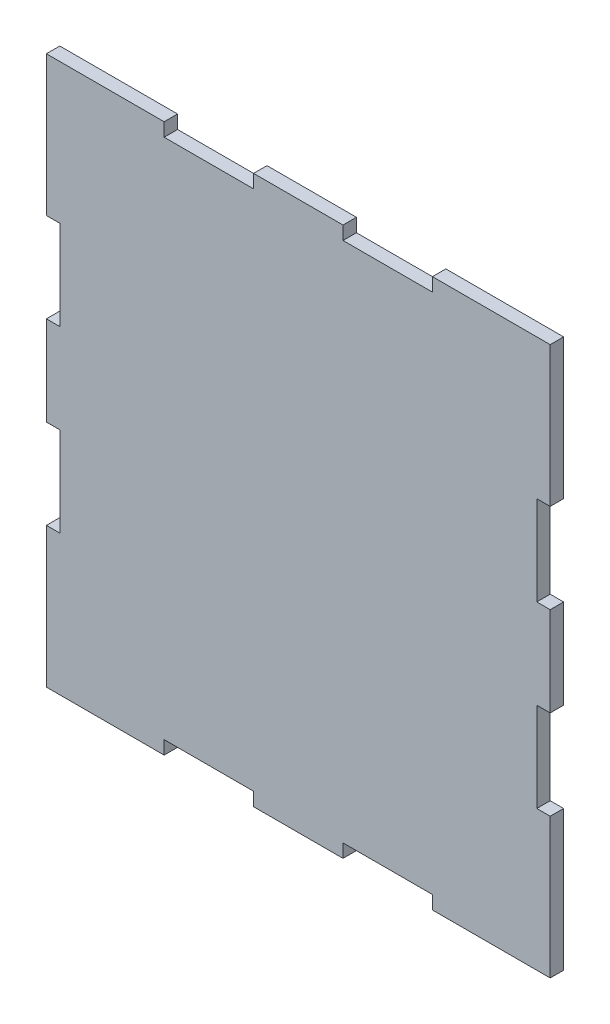
ISO-10303-21;
HEADER;
FILE_DESCRIPTION(('STEP AP214'),'2;1');
FILE_NAME('part.step','',(''),(''),'','','');
FILE_SCHEMA(('AUTOMOTIVE_DESIGN { 1 0 10303 214 1 1 1 1 }'));
ENDSEC;
DATA;
#1=APPLICATION_CONTEXT('core data for automotive mechanical design processes');
#2=APPLICATION_PROTOCOL_DEFINITION('international standard','automotive_design',2000,#1);
#3=PRODUCT_CONTEXT('',#1,'mechanical');
#4=PRODUCT('Part','Part','',(#3));
#5=PRODUCT_RELATED_PRODUCT_CATEGORY('part','',(#4));
#6=PRODUCT_DEFINITION_FORMATION('','',#4);
#7=PRODUCT_DEFINITION_CONTEXT('part definition',#1,'design');
#8=PRODUCT_DEFINITION('design','',#6,#7);
#9=PRODUCT_DEFINITION_SHAPE('','',#8);
#10=(LENGTH_UNIT() NAMED_UNIT(*) SI_UNIT(.MILLI.,.METRE.));
#11=(NAMED_UNIT(*) PLANE_ANGLE_UNIT() SI_UNIT($,.RADIAN.));
#12=(NAMED_UNIT(*) SI_UNIT($,.STERADIAN.) SOLID_ANGLE_UNIT());
#13=UNCERTAINTY_MEASURE_WITH_UNIT(LENGTH_MEASURE(1.E-05),#10,'distance_accuracy_value','');
#14=(GEOMETRIC_REPRESENTATION_CONTEXT(3) GLOBAL_UNCERTAINTY_ASSIGNED_CONTEXT((#13)) GLOBAL_UNIT_ASSIGNED_CONTEXT((#10,
#11,#12)) REPRESENTATION_CONTEXT('',''));
#15=CARTESIAN_POINT('',(0.,0.,0.));
#16=DIRECTION('',(0.,0.,1.));
#17=DIRECTION('',(1.,0.,0.));
#18=AXIS2_PLACEMENT_3D('',#15,#16,#17);
#19=CARTESIAN_POINT('',(0.,269.84,9.));
#20=DIRECTION('',(0.,-1.,0.));
#21=DIRECTION('',(0.,0.,-1.));
#22=AXIS2_PLACEMENT_3D('',#19,#20,#21);
#23=PLANE('',#22);
#24=DIRECTION('',(-1.,0.,0.));
#25=VECTOR('',#24,1.);
#26=CARTESIAN_POINT('',(0.,269.84,0.));
#27=LINE('',#26,#25);
#28=CARTESIAN_POINT('',(320.,269.84,0.));
#29=VERTEX_POINT('',#28);
#30=CARTESIAN_POINT('',(311.,269.84,0.));
#31=VERTEX_POINT('',#30);
#32=EDGE_CURVE('E309',#29,#31,#27,.T.);
#33=ORIENTED_EDGE('',*,*,#32,.F.);
#34=DIRECTION('',(0.,0.,-1.));
#35=VECTOR('',#34,1.);
#36=CARTESIAN_POINT('',(320.,269.84,9.));
#37=LINE('',#36,#35);
#38=CARTESIAN_POINT('',(320.,269.84,9.));
#39=VERTEX_POINT('',#38);
#40=EDGE_CURVE('E11',#39,#29,#37,.T.);
#41=ORIENTED_EDGE('',*,*,#40,.F.);
#42=DIRECTION('',(-1.,0.,0.));
#43=VECTOR('',#42,1.);
#44=CARTESIAN_POINT('',(0.,269.84,9.));
#45=LINE('',#44,#43);
#46=CARTESIAN_POINT('',(311.,269.84,9.));
#47=VERTEX_POINT('',#46);
#48=EDGE_CURVE('E402',#39,#47,#45,.T.);
#49=ORIENTED_EDGE('',*,*,#48,.T.);
#50=DIRECTION('',(0.,0.,-1.));
#51=VECTOR('',#50,1.);
#52=CARTESIAN_POINT('',(311.,269.84,9.));
#53=LINE('',#52,#51);
#54=EDGE_CURVE('E63',#47,#31,#53,.T.);
#55=ORIENTED_EDGE('',*,*,#54,.T.);
#56=EDGE_LOOP('',(#33,#41,#49,#55));
#57=FACE_BOUND('',#56,.T.);
#58=ADVANCED_FACE('F47',(#57),#23,.T.);
#59=CARTESIAN_POINT('',(320.,0.,9.));
#60=DIRECTION('',(-1.,0.,0.));
#61=DIRECTION('',(0.,0.,1.));
#62=AXIS2_PLACEMENT_3D('',#59,#60,#61);
#63=PLANE('',#62);
#64=DIRECTION('',(0.,1.,0.));
#65=VECTOR('',#64,1.);
#66=CARTESIAN_POINT('',(320.,0.,0.));
#67=LINE('',#66,#65);
#68=CARTESIAN_POINT('',(320.,363.84,0.));
#69=VERTEX_POINT('',#68);
#70=EDGE_CURVE('E311',#29,#69,#67,.T.);
#71=ORIENTED_EDGE('',*,*,#70,.T.);
#72=DIRECTION('',(0.,0.,-1.));
#73=VECTOR('',#72,1.);
#74=CARTESIAN_POINT('',(320.,363.84,9.));
#75=LINE('',#74,#73);
#76=CARTESIAN_POINT('',(320.,363.84,9.));
#77=VERTEX_POINT('',#76);
#78=EDGE_CURVE('E55',#77,#69,#75,.T.);
#79=ORIENTED_EDGE('',*,*,#78,.F.);
#80=DIRECTION('',(0.,1.,0.));
#81=VECTOR('',#80,1.);
#82=CARTESIAN_POINT('',(320.,0.,9.));
#83=LINE('',#82,#81);
#84=EDGE_CURVE('E498',#39,#77,#83,.T.);
#85=ORIENTED_EDGE('',*,*,#84,.F.);
#86=ORIENTED_EDGE('',*,*,#40,.T.);
#87=EDGE_LOOP('',(#71,#79,#85,#86));
#88=FACE_BOUND('',#87,.T.);
#89=ADVANCED_FACE('F484',(#88),#63,.F.);
#90=CARTESIAN_POINT('',(6.73239242132706E-12,363.840000000006,9.));
#91=DIRECTION('',(0.,1.,0.));
#92=DIRECTION('',(-1.,0.,0.));
#93=AXIS2_PLACEMENT_3D('',#90,#91,#92);
#94=PLANE('',#93);
#95=DIRECTION('',(1.,0.,0.));
#96=VECTOR('',#95,1.);
#97=CARTESIAN_POINT('',(6.73239242132706E-12,363.840000000006,0.));
#98=LINE('',#97,#96);
#99=CARTESIAN_POINT('',(241.,363.84,0.));
#100=VERTEX_POINT('',#99);
#101=EDGE_CURVE('E314',#100,#69,#98,.T.);
#102=ORIENTED_EDGE('',*,*,#101,.F.);
#103=DIRECTION('',(0.,0.,-1.));
#104=VECTOR('',#103,1.);
#105=CARTESIAN_POINT('',(241.,363.84,9.));
#106=LINE('',#105,#104);
#107=CARTESIAN_POINT('',(241.,363.84,9.));
#108=VERTEX_POINT('',#107);
#109=EDGE_CURVE('E474',#108,#100,#106,.T.);
#110=ORIENTED_EDGE('',*,*,#109,.F.);
#111=DIRECTION('',(1.,0.,0.));
#112=VECTOR('',#111,1.);
#113=CARTESIAN_POINT('',(6.73239242132706E-12,363.840000000006,9.));
#114=LINE('',#113,#112);
#115=EDGE_CURVE('E481',#108,#77,#114,.T.);
#116=ORIENTED_EDGE('',*,*,#115,.T.);
#117=ORIENTED_EDGE('',*,*,#78,.T.);
#118=EDGE_LOOP('',(#102,#110,#116,#117));
#119=FACE_BOUND('',#118,.T.);
#120=ADVANCED_FACE('F479',(#119),#94,.T.);
#121=CARTESIAN_POINT('',(241.,0.,9.));
#122=DIRECTION('',(1.,0.,0.));
#123=DIRECTION('',(0.,0.,-1.));
#124=AXIS2_PLACEMENT_3D('',#121,#122,#123);
#125=PLANE('',#124);
#126=DIRECTION('',(0.,-1.,0.));
#127=VECTOR('',#126,1.);
#128=CARTESIAN_POINT('',(241.,0.,0.));
#129=LINE('',#128,#127);
#130=CARTESIAN_POINT('',(241.,354.84,0.));
#131=VERTEX_POINT('',#130);
#132=EDGE_CURVE('E317',#100,#131,#129,.T.);
#133=ORIENTED_EDGE('',*,*,#132,.T.);
#134=DIRECTION('',(0.,0.,-1.));
#135=VECTOR('',#134,1.);
#136=CARTESIAN_POINT('',(241.,354.84,9.));
#137=LINE('',#136,#135);
#138=CARTESIAN_POINT('',(241.,354.84,9.));
#139=VERTEX_POINT('',#138);
#140=EDGE_CURVE('E472',#139,#131,#137,.T.);
#141=ORIENTED_EDGE('',*,*,#140,.F.);
#142=DIRECTION('',(0.,-1.,0.));
#143=VECTOR('',#142,1.);
#144=CARTESIAN_POINT('',(241.,0.,9.));
#145=LINE('',#144,#143);
#146=EDGE_CURVE('E494',#108,#139,#145,.T.);
#147=ORIENTED_EDGE('',*,*,#146,.F.);
#148=ORIENTED_EDGE('',*,*,#109,.T.);
#149=EDGE_LOOP('',(#133,#141,#147,#148));
#150=FACE_BOUND('',#149,.T.);
#151=ADVANCED_FACE('F491',(#150),#125,.F.);
#152=CARTESIAN_POINT('',(3.28292948381659E-13,354.84,9.));
#153=DIRECTION('',(0.,1.,0.));
#154=DIRECTION('',(-1.,0.,0.));
#155=AXIS2_PLACEMENT_3D('',#152,#153,#154);
#156=PLANE('',#155);
#157=DIRECTION('',(1.,0.,0.));
#158=VECTOR('',#157,1.);
#159=CARTESIAN_POINT('',(3.28292948381659E-13,354.84,0.));
#160=LINE('',#159,#158);
#161=CARTESIAN_POINT('',(181.,354.84,0.));
#162=VERTEX_POINT('',#161);
#163=EDGE_CURVE('E320',#162,#131,#160,.T.);
#164=ORIENTED_EDGE('',*,*,#163,.F.);
#165=DIRECTION('',(0.,0.,-1.));
#166=VECTOR('',#165,1.);
#167=CARTESIAN_POINT('',(181.,354.84,9.));
#168=LINE('',#167,#166);
#169=CARTESIAN_POINT('',(181.,354.84,9.));
#170=VERTEX_POINT('',#169);
#171=EDGE_CURVE('E470',#170,#162,#168,.T.);
#172=ORIENTED_EDGE('',*,*,#171,.F.);
#173=DIRECTION('',(1.,0.,0.));
#174=VECTOR('',#173,1.);
#175=CARTESIAN_POINT('',(3.28292948381659E-13,354.84,9.));
#176=LINE('',#175,#174);
#177=EDGE_CURVE('E496',#170,#139,#176,.T.);
#178=ORIENTED_EDGE('',*,*,#177,.T.);
#179=ORIENTED_EDGE('',*,*,#140,.T.);
#180=EDGE_LOOP('',(#164,#172,#178,#179));
#181=FACE_BOUND('',#180,.T.);
#182=ADVANCED_FACE('F602',(#181),#156,.T.);
#183=CARTESIAN_POINT('',(181.,0.,9.));
#184=DIRECTION('',(1.,0.,0.));
#185=DIRECTION('',(0.,0.,-1.));
#186=AXIS2_PLACEMENT_3D('',#183,#184,#185);
#187=PLANE('',#186);
#188=DIRECTION('',(0.,-1.,0.));
#189=VECTOR('',#188,1.);
#190=CARTESIAN_POINT('',(181.,0.,0.));
#191=LINE('',#190,#189);
#192=CARTESIAN_POINT('',(181.,363.84,0.));
#193=VERTEX_POINT('',#192);
#194=EDGE_CURVE('E323',#193,#162,#191,.T.);
#195=ORIENTED_EDGE('',*,*,#194,.F.);
#196=DIRECTION('',(0.,0.,-1.));
#197=VECTOR('',#196,1.);
#198=CARTESIAN_POINT('',(181.,363.84,9.));
#199=LINE('',#198,#197);
#200=CARTESIAN_POINT('',(181.,363.84,9.));
#201=VERTEX_POINT('',#200);
#202=EDGE_CURVE('E468',#201,#193,#199,.T.);
#203=ORIENTED_EDGE('',*,*,#202,.F.);
#204=DIRECTION('',(0.,-1.,0.));
#205=VECTOR('',#204,1.);
#206=CARTESIAN_POINT('',(181.,0.,9.));
#207=LINE('',#206,#205);
#208=EDGE_CURVE('E504',#201,#170,#207,.T.);
#209=ORIENTED_EDGE('',*,*,#208,.T.);
#210=ORIENTED_EDGE('',*,*,#171,.T.);
#211=EDGE_LOOP('',(#195,#203,#209,#210));
#212=FACE_BOUND('',#211,.T.);
#213=ADVANCED_FACE('F605',(#212),#187,.T.);
#214=CARTESIAN_POINT('',(0.,363.84,9.));
#215=DIRECTION('',(0.,1.,0.));
#216=DIRECTION('',(0.,0.,1.));
#217=AXIS2_PLACEMENT_3D('',#214,#215,#216);
#218=PLANE('',#217);
#219=DIRECTION('',(1.,0.,0.));
#220=VECTOR('',#219,1.);
#221=CARTESIAN_POINT('',(0.,363.84,0.));
#222=LINE('',#221,#220);
#223=CARTESIAN_POINT('',(121.,363.84,0.));
#224=VERTEX_POINT('',#223);
#225=EDGE_CURVE('E326',#224,#193,#222,.T.);
#226=ORIENTED_EDGE('',*,*,#225,.F.);
#227=DIRECTION('',(0.,0.,-1.));
#228=VECTOR('',#227,1.);
#229=CARTESIAN_POINT('',(121.,363.84,9.));
#230=LINE('',#229,#228);
#231=CARTESIAN_POINT('',(121.,363.84,9.));
#232=VERTEX_POINT('',#231);
#233=EDGE_CURVE('E466',#232,#224,#230,.T.);
#234=ORIENTED_EDGE('',*,*,#233,.F.);
#235=DIRECTION('',(1.,0.,0.));
#236=VECTOR('',#235,1.);
#237=CARTESIAN_POINT('',(0.,363.84,9.));
#238=LINE('',#237,#236);
#239=EDGE_CURVE('E507',#232,#201,#238,.T.);
#240=ORIENTED_EDGE('',*,*,#239,.T.);
#241=ORIENTED_EDGE('',*,*,#202,.T.);
#242=EDGE_LOOP('',(#226,#234,#240,#241));
#243=FACE_BOUND('',#242,.T.);
#244=ADVANCED_FACE('F609',(#243),#218,.T.);
#245=CARTESIAN_POINT('',(121.,0.,9.));
#246=DIRECTION('',(1.,0.,0.));
#247=DIRECTION('',(0.,0.,-1.));
#248=AXIS2_PLACEMENT_3D('',#245,#246,#247);
#249=PLANE('',#248);
#250=DIRECTION('',(0.,-1.,0.));
#251=VECTOR('',#250,1.);
#252=CARTESIAN_POINT('',(121.,0.,0.));
#253=LINE('',#252,#251);
#254=CARTESIAN_POINT('',(121.,354.84,0.));
#255=VERTEX_POINT('',#254);
#256=EDGE_CURVE('E329',#224,#255,#253,.T.);
#257=ORIENTED_EDGE('',*,*,#256,.T.);
#258=DIRECTION('',(0.,0.,-1.));
#259=VECTOR('',#258,1.);
#260=CARTESIAN_POINT('',(121.,354.84,9.));
#261=LINE('',#260,#259);
#262=CARTESIAN_POINT('',(121.,354.84,9.));
#263=VERTEX_POINT('',#262);
#264=EDGE_CURVE('E464',#263,#255,#261,.T.);
#265=ORIENTED_EDGE('',*,*,#264,.F.);
#266=DIRECTION('',(0.,-1.,0.));
#267=VECTOR('',#266,1.);
#268=CARTESIAN_POINT('',(121.,0.,9.));
#269=LINE('',#268,#267);
#270=EDGE_CURVE('E510',#232,#263,#269,.T.);
#271=ORIENTED_EDGE('',*,*,#270,.F.);
#272=ORIENTED_EDGE('',*,*,#233,.T.);
#273=EDGE_LOOP('',(#257,#265,#271,#272));
#274=FACE_BOUND('',#273,.T.);
#275=ADVANCED_FACE('F613',(#274),#249,.F.);
#276=CARTESIAN_POINT('',(-3.28292948381659E-13,354.84,9.));
#277=DIRECTION('',(0.,1.,0.));
#278=DIRECTION('',(-1.,0.,0.));
#279=AXIS2_PLACEMENT_3D('',#276,#277,#278);
#280=PLANE('',#279);
#281=DIRECTION('',(1.,0.,0.));
#282=VECTOR('',#281,1.);
#283=CARTESIAN_POINT('',(-3.28292948381659E-13,354.84,0.));
#284=LINE('',#283,#282);
#285=CARTESIAN_POINT('',(60.9999999999999,354.84,0.));
#286=VERTEX_POINT('',#285);
#287=EDGE_CURVE('E332',#286,#255,#284,.T.);
#288=ORIENTED_EDGE('',*,*,#287,.F.);
#289=DIRECTION('',(0.,0.,-1.));
#290=VECTOR('',#289,1.);
#291=CARTESIAN_POINT('',(60.9999999999999,354.84,9.));
#292=LINE('',#291,#290);
#293=CARTESIAN_POINT('',(60.9999999999999,354.84,9.));
#294=VERTEX_POINT('',#293);
#295=EDGE_CURVE('E462',#294,#286,#292,.T.);
#296=ORIENTED_EDGE('',*,*,#295,.F.);
#297=DIRECTION('',(1.,0.,0.));
#298=VECTOR('',#297,1.);
#299=CARTESIAN_POINT('',(-3.28292948381659E-13,354.84,9.));
#300=LINE('',#299,#298);
#301=EDGE_CURVE('E512',#294,#263,#300,.T.);
#302=ORIENTED_EDGE('',*,*,#301,.T.);
#303=ORIENTED_EDGE('',*,*,#264,.T.);
#304=EDGE_LOOP('',(#288,#296,#302,#303));
#305=FACE_BOUND('',#304,.T.);
#306=ADVANCED_FACE('F617',(#305),#280,.T.);
#307=CARTESIAN_POINT('',(60.9999999999999,0.,9.));
#308=DIRECTION('',(1.,0.,0.));
#309=DIRECTION('',(0.,0.,-1.));
#310=AXIS2_PLACEMENT_3D('',#307,#308,#309);
#311=PLANE('',#310);
#312=DIRECTION('',(0.,-1.,0.));
#313=VECTOR('',#312,1.);
#314=CARTESIAN_POINT('',(60.9999999999999,0.,0.));
#315=LINE('',#314,#313);
#316=CARTESIAN_POINT('',(60.9999999999999,363.84,0.));
#317=VERTEX_POINT('',#316);
#318=EDGE_CURVE('E335',#317,#286,#315,.T.);
#319=ORIENTED_EDGE('',*,*,#318,.F.);
#320=DIRECTION('',(0.,0.,-1.));
#321=VECTOR('',#320,1.);
#322=CARTESIAN_POINT('',(60.9999999999999,363.84,9.));
#323=LINE('',#322,#321);
#324=CARTESIAN_POINT('',(60.9999999999999,363.84,9.));
#325=VERTEX_POINT('',#324);
#326=EDGE_CURVE('E460',#325,#317,#323,.T.);
#327=ORIENTED_EDGE('',*,*,#326,.F.);
#328=DIRECTION('',(0.,-1.,0.));
#329=VECTOR('',#328,1.);
#330=CARTESIAN_POINT('',(60.9999999999999,0.,9.));
#331=LINE('',#330,#329);
#332=EDGE_CURVE('E515',#325,#294,#331,.T.);
#333=ORIENTED_EDGE('',*,*,#332,.T.);
#334=ORIENTED_EDGE('',*,*,#295,.T.);
#335=EDGE_LOOP('',(#319,#327,#333,#334));
#336=FACE_BOUND('',#335,.T.);
#337=ADVANCED_FACE('F621',(#336),#311,.T.);
#338=CARTESIAN_POINT('',(-5.7706220754231E-13,363.84,9.));
#339=DIRECTION('',(0.,1.,0.));
#340=DIRECTION('',(-1.,0.,0.));
#341=AXIS2_PLACEMENT_3D('',#338,#339,#340);
#342=PLANE('',#341);
#343=DIRECTION('',(1.,0.,0.));
#344=VECTOR('',#343,1.);
#345=CARTESIAN_POINT('',(-5.7706220754231E-13,363.84,0.));
#346=LINE('',#345,#344);
#347=CARTESIAN_POINT('',(-18.0000000000001,363.84,0.));
#348=VERTEX_POINT('',#347);
#349=EDGE_CURVE('E338',#348,#317,#346,.T.);
#350=ORIENTED_EDGE('',*,*,#349,.F.);
#351=DIRECTION('',(0.,0.,-1.));
#352=VECTOR('',#351,1.);
#353=CARTESIAN_POINT('',(-18.0000000000001,363.84,9.));
#354=LINE('',#353,#352);
#355=CARTESIAN_POINT('',(-18.0000000000001,363.84,9.));
#356=VERTEX_POINT('',#355);
#357=EDGE_CURVE('E458',#356,#348,#354,.T.);
#358=ORIENTED_EDGE('',*,*,#357,.F.);
#359=DIRECTION('',(1.,0.,0.));
#360=VECTOR('',#359,1.);
#361=CARTESIAN_POINT('',(-5.7706220754231E-13,363.84,9.));
#362=LINE('',#361,#360);
#363=EDGE_CURVE('E518',#356,#325,#362,.T.);
#364=ORIENTED_EDGE('',*,*,#363,.T.);
#365=ORIENTED_EDGE('',*,*,#326,.T.);
#366=EDGE_LOOP('',(#350,#358,#364,#365));
#367=FACE_BOUND('',#366,.T.);
#368=ADVANCED_FACE('F625',(#367),#342,.T.);
#369=CARTESIAN_POINT('',(-17.9999999999999,0.,9.));
#370=DIRECTION('',(-1.,0.,0.));
#371=DIRECTION('',(0.,-1.,0.));
#372=AXIS2_PLACEMENT_3D('',#369,#370,#371);
#373=PLANE('',#372);
#374=DIRECTION('',(0.,1.,0.));
#375=VECTOR('',#374,1.);
#376=CARTESIAN_POINT('',(-17.9999999999999,0.,0.));
#377=LINE('',#376,#375);
#378=CARTESIAN_POINT('',(-18.,269.84,0.));
#379=VERTEX_POINT('',#378);
#380=EDGE_CURVE('E341',#379,#348,#377,.T.);
#381=ORIENTED_EDGE('',*,*,#380,.F.);
#382=DIRECTION('',(0.,0.,-1.));
#383=VECTOR('',#382,1.);
#384=CARTESIAN_POINT('',(-18.,269.84,9.));
#385=LINE('',#384,#383);
#386=CARTESIAN_POINT('',(-18.,269.84,9.));
#387=VERTEX_POINT('',#386);
#388=EDGE_CURVE('E456',#387,#379,#385,.T.);
#389=ORIENTED_EDGE('',*,*,#388,.F.);
#390=DIRECTION('',(0.,1.,0.));
#391=VECTOR('',#390,1.);
#392=CARTESIAN_POINT('',(-17.9999999999999,0.,9.));
#393=LINE('',#392,#391);
#394=EDGE_CURVE('E521',#387,#356,#393,.T.);
#395=ORIENTED_EDGE('',*,*,#394,.T.);
#396=ORIENTED_EDGE('',*,*,#357,.T.);
#397=EDGE_LOOP('',(#381,#389,#395,#396));
#398=FACE_BOUND('',#397,.T.);
#399=ADVANCED_FACE('F629',(#398),#373,.T.);
#400=CARTESIAN_POINT('',(0.,269.84,9.));
#401=DIRECTION('',(0.,1.,0.));
#402=DIRECTION('',(0.,0.,1.));
#403=AXIS2_PLACEMENT_3D('',#400,#401,#402);
#404=PLANE('',#403);
#405=DIRECTION('',(1.,0.,0.));
#406=VECTOR('',#405,1.);
#407=CARTESIAN_POINT('',(0.,269.84,0.));
#408=LINE('',#407,#406);
#409=CARTESIAN_POINT('',(-8.99999999999998,269.84,0.));
#410=VERTEX_POINT('',#409);
#411=EDGE_CURVE('E344',#379,#410,#408,.T.);
#412=ORIENTED_EDGE('',*,*,#411,.T.);
#413=DIRECTION('',(0.,0.,-1.));
#414=VECTOR('',#413,1.);
#415=CARTESIAN_POINT('',(-8.99999999999998,269.84,9.));
#416=LINE('',#415,#414);
#417=CARTESIAN_POINT('',(-8.99999999999998,269.84,9.));
#418=VERTEX_POINT('',#417);
#419=EDGE_CURVE('E453',#418,#410,#416,.T.);
#420=ORIENTED_EDGE('',*,*,#419,.F.);
#421=DIRECTION('',(1.,0.,0.));
#422=VECTOR('',#421,1.);
#423=CARTESIAN_POINT('',(0.,269.84,9.));
#424=LINE('',#423,#422);
#425=EDGE_CURVE('E524',#387,#418,#424,.T.);
#426=ORIENTED_EDGE('',*,*,#425,.F.);
#427=ORIENTED_EDGE('',*,*,#388,.T.);
#428=EDGE_LOOP('',(#412,#420,#426,#427));
#429=FACE_BOUND('',#428,.T.);
#430=ADVANCED_FACE('F633',(#429),#404,.F.);
#431=CARTESIAN_POINT('',(-9.00000000000005,0.,9.));
#432=DIRECTION('',(1.,0.,0.));
#433=DIRECTION('',(0.,1.,0.));
#434=AXIS2_PLACEMENT_3D('',#431,#432,#433);
#435=PLANE('',#434);
#436=DIRECTION('',(0.,-1.,0.));
#437=VECTOR('',#436,1.);
#438=CARTESIAN_POINT('',(-9.00000000000005,0.,0.));
#439=LINE('',#438,#437);
#440=CARTESIAN_POINT('',(-9.,209.84,0.));
#441=VERTEX_POINT('',#440);
#442=EDGE_CURVE('E346',#410,#441,#439,.T.);
#443=ORIENTED_EDGE('',*,*,#442,.T.);
#444=DIRECTION('',(0.,0.,-1.));
#445=VECTOR('',#444,1.);
#446=CARTESIAN_POINT('',(-9.,209.84,9.));
#447=LINE('',#446,#445);
#448=CARTESIAN_POINT('',(-9.,209.84,9.));
#449=VERTEX_POINT('',#448);
#450=EDGE_CURVE('E450',#449,#441,#447,.T.);
#451=ORIENTED_EDGE('',*,*,#450,.F.);
#452=DIRECTION('',(0.,-1.,0.));
#453=VECTOR('',#452,1.);
#454=CARTESIAN_POINT('',(-9.00000000000005,0.,9.));
#455=LINE('',#454,#453);
#456=EDGE_CURVE('E526',#418,#449,#455,.T.);
#457=ORIENTED_EDGE('',*,*,#456,.F.);
#458=ORIENTED_EDGE('',*,*,#419,.T.);
#459=EDGE_LOOP('',(#443,#451,#457,#458));
#460=FACE_BOUND('',#459,.T.);
#461=ADVANCED_FACE('F637',(#460),#435,.F.);
#462=CARTESIAN_POINT('',(-1.29427333048524E-12,209.84,9.));
#463=DIRECTION('',(0.,-1.,0.));
#464=DIRECTION('',(1.,0.,0.));
#465=AXIS2_PLACEMENT_3D('',#462,#463,#464);
#466=PLANE('',#465);
#467=DIRECTION('',(-1.,0.,0.));
#468=VECTOR('',#467,1.);
#469=CARTESIAN_POINT('',(-1.29427333048524E-12,209.84,0.));
#470=LINE('',#469,#468);
#471=CARTESIAN_POINT('',(-18.,209.84,0.));
#472=VERTEX_POINT('',#471);
#473=EDGE_CURVE('E348',#441,#472,#470,.T.);
#474=ORIENTED_EDGE('',*,*,#473,.T.);
#475=DIRECTION('',(0.,0.,-1.));
#476=VECTOR('',#475,1.);
#477=CARTESIAN_POINT('',(-18.,209.84,9.));
#478=LINE('',#477,#476);
#479=CARTESIAN_POINT('',(-18.,209.84,9.));
#480=VERTEX_POINT('',#479);
#481=EDGE_CURVE('E448',#480,#472,#478,.T.);
#482=ORIENTED_EDGE('',*,*,#481,.F.);
#483=DIRECTION('',(-1.,0.,0.));
#484=VECTOR('',#483,1.);
#485=CARTESIAN_POINT('',(-1.29427333048524E-12,209.84,9.));
#486=LINE('',#485,#484);
#487=EDGE_CURVE('E528',#449,#480,#486,.T.);
#488=ORIENTED_EDGE('',*,*,#487,.F.);
#489=ORIENTED_EDGE('',*,*,#450,.T.);
#490=EDGE_LOOP('',(#474,#482,#488,#489));
#491=FACE_BOUND('',#490,.T.);
#492=ADVANCED_FACE('F641',(#491),#466,.F.);
#493=CARTESIAN_POINT('',(-18.,0.,9.));
#494=DIRECTION('',(-1.,0.,0.));
#495=DIRECTION('',(0.,0.,1.));
#496=AXIS2_PLACEMENT_3D('',#493,#494,#495);
#497=PLANE('',#496);
#498=DIRECTION('',(0.,1.,0.));
#499=VECTOR('',#498,1.);
#500=CARTESIAN_POINT('',(-18.,0.,0.));
#501=LINE('',#500,#499);
#502=CARTESIAN_POINT('',(-18.,149.84,0.));
#503=VERTEX_POINT('',#502);
#504=EDGE_CURVE('E351',#503,#472,#501,.T.);
#505=ORIENTED_EDGE('',*,*,#504,.F.);
#506=DIRECTION('',(0.,0.,-1.));
#507=VECTOR('',#506,1.);
#508=CARTESIAN_POINT('',(-18.,149.84,9.));
#509=LINE('',#508,#507);
#510=CARTESIAN_POINT('',(-18.,149.84,9.));
#511=VERTEX_POINT('',#510);
#512=EDGE_CURVE('E446',#511,#503,#509,.T.);
#513=ORIENTED_EDGE('',*,*,#512,.F.);
#514=DIRECTION('',(0.,1.,0.));
#515=VECTOR('',#514,1.);
#516=CARTESIAN_POINT('',(-18.,0.,9.));
#517=LINE('',#516,#515);
#518=EDGE_CURVE('E530',#511,#480,#517,.T.);
#519=ORIENTED_EDGE('',*,*,#518,.T.);
#520=ORIENTED_EDGE('',*,*,#481,.T.);
#521=EDGE_LOOP('',(#505,#513,#519,#520));
#522=FACE_BOUND('',#521,.T.);
#523=ADVANCED_FACE('F645',(#522),#497,.T.);
#524=CARTESIAN_POINT('',(9.24198988943519E-13,149.84,9.));
#525=DIRECTION('',(0.,-1.,0.));
#526=DIRECTION('',(1.,0.,0.));
#527=AXIS2_PLACEMENT_3D('',#524,#525,#526);
#528=PLANE('',#527);
#529=DIRECTION('',(-1.,0.,0.));
#530=VECTOR('',#529,1.);
#531=CARTESIAN_POINT('',(9.24198988943519E-13,149.84,0.));
#532=LINE('',#531,#530);
#533=CARTESIAN_POINT('',(-9.,149.84,0.));
#534=VERTEX_POINT('',#533);
#535=EDGE_CURVE('E354',#534,#503,#532,.T.);
#536=ORIENTED_EDGE('',*,*,#535,.F.);
#537=DIRECTION('',(0.,0.,-1.));
#538=VECTOR('',#537,1.);
#539=CARTESIAN_POINT('',(-9.,149.84,9.));
#540=LINE('',#539,#538);
#541=CARTESIAN_POINT('',(-9.,149.84,9.));
#542=VERTEX_POINT('',#541);
#543=EDGE_CURVE('E444',#542,#534,#540,.T.);
#544=ORIENTED_EDGE('',*,*,#543,.F.);
#545=DIRECTION('',(-1.,0.,0.));
#546=VECTOR('',#545,1.);
#547=CARTESIAN_POINT('',(9.24198988943519E-13,149.84,9.));
#548=LINE('',#547,#546);
#549=EDGE_CURVE('E533',#542,#511,#548,.T.);
#550=ORIENTED_EDGE('',*,*,#549,.T.);
#551=ORIENTED_EDGE('',*,*,#512,.T.);
#552=EDGE_LOOP('',(#536,#544,#550,#551));
#553=FACE_BOUND('',#552,.T.);
#554=ADVANCED_FACE('F649',(#553),#528,.T.);
#555=CARTESIAN_POINT('',(-8.99999999999996,0.,9.));
#556=DIRECTION('',(-1.,0.,0.));
#557=DIRECTION('',(0.,-1.,0.));
#558=AXIS2_PLACEMENT_3D('',#555,#556,#557);
#559=PLANE('',#558);
#560=DIRECTION('',(0.,1.,0.));
#561=VECTOR('',#560,1.);
#562=CARTESIAN_POINT('',(-8.99999999999996,0.,0.));
#563=LINE('',#562,#561);
#564=CARTESIAN_POINT('',(-8.99999999999998,89.8400000000004,0.));
#565=VERTEX_POINT('',#564);
#566=EDGE_CURVE('E357',#565,#534,#563,.T.);
#567=ORIENTED_EDGE('',*,*,#566,.F.);
#568=DIRECTION('',(0.,0.,-1.));
#569=VECTOR('',#568,1.);
#570=CARTESIAN_POINT('',(-8.99999999999998,89.8400000000004,9.));
#571=LINE('',#570,#569);
#572=CARTESIAN_POINT('',(-8.99999999999998,89.8400000000004,9.));
#573=VERTEX_POINT('',#572);
#574=EDGE_CURVE('E442',#573,#565,#571,.T.);
#575=ORIENTED_EDGE('',*,*,#574,.F.);
#576=DIRECTION('',(0.,1.,0.));
#577=VECTOR('',#576,1.);
#578=CARTESIAN_POINT('',(-8.99999999999996,0.,9.));
#579=LINE('',#578,#577);
#580=EDGE_CURVE('E536',#573,#542,#579,.T.);
#581=ORIENTED_EDGE('',*,*,#580,.T.);
#582=ORIENTED_EDGE('',*,*,#543,.T.);
#583=EDGE_LOOP('',(#567,#575,#581,#582));
#584=FACE_BOUND('',#583,.T.);
#585=ADVANCED_FACE('F653',(#584),#559,.T.);
#586=CARTESIAN_POINT('',(0.,89.8400000000004,9.));
#587=DIRECTION('',(0.,1.,0.));
#588=DIRECTION('',(0.,0.,1.));
#589=AXIS2_PLACEMENT_3D('',#586,#587,#588);
#590=PLANE('',#589);
#591=DIRECTION('',(1.,0.,0.));
#592=VECTOR('',#591,1.);
#593=CARTESIAN_POINT('',(0.,89.8400000000004,0.));
#594=LINE('',#593,#592);
#595=CARTESIAN_POINT('',(-18.,89.8400000000004,0.));
#596=VERTEX_POINT('',#595);
#597=EDGE_CURVE('E360',#596,#565,#594,.T.);
#598=ORIENTED_EDGE('',*,*,#597,.F.);
#599=DIRECTION('',(0.,0.,-1.));
#600=VECTOR('',#599,1.);
#601=CARTESIAN_POINT('',(-18.,89.8400000000004,9.));
#602=LINE('',#601,#600);
#603=CARTESIAN_POINT('',(-18.,89.8400000000004,9.));
#604=VERTEX_POINT('',#603);
#605=EDGE_CURVE('E440',#604,#596,#602,.T.);
#606=ORIENTED_EDGE('',*,*,#605,.F.);
#607=DIRECTION('',(1.,0.,0.));
#608=VECTOR('',#607,1.);
#609=CARTESIAN_POINT('',(0.,89.8400000000004,9.));
#610=LINE('',#609,#608);
#611=EDGE_CURVE('E539',#604,#573,#610,.T.);
#612=ORIENTED_EDGE('',*,*,#611,.T.);
#613=ORIENTED_EDGE('',*,*,#574,.T.);
#614=EDGE_LOOP('',(#598,#606,#612,#613));
#615=FACE_BOUND('',#614,.T.);
#616=ADVANCED_FACE('F657',(#615),#590,.T.);
#617=CARTESIAN_POINT('',(-18.,0.,9.));
#618=DIRECTION('',(-1.,0.,0.));
#619=DIRECTION('',(0.,-1.,0.));
#620=AXIS2_PLACEMENT_3D('',#617,#618,#619);
#621=PLANE('',#620);
#622=DIRECTION('',(0.,1.,0.));
#623=VECTOR('',#622,1.);
#624=CARTESIAN_POINT('',(-18.,0.,0.));
#625=LINE('',#624,#623);
#626=CARTESIAN_POINT('',(-18.,-4.15999999999954,0.));
#627=VERTEX_POINT('',#626);
#628=EDGE_CURVE('E363',#627,#596,#625,.T.);
#629=ORIENTED_EDGE('',*,*,#628,.F.);
#630=DIRECTION('',(0.,0.,-1.));
#631=VECTOR('',#630,1.);
#632=CARTESIAN_POINT('',(-18.,-4.15999999999954,9.));
#633=LINE('',#632,#631);
#634=CARTESIAN_POINT('',(-18.,-4.15999999999954,9.));
#635=VERTEX_POINT('',#634);
#636=EDGE_CURVE('E438',#635,#627,#633,.T.);
#637=ORIENTED_EDGE('',*,*,#636,.F.);
#638=DIRECTION('',(0.,1.,0.));
#639=VECTOR('',#638,1.);
#640=CARTESIAN_POINT('',(-18.,0.,9.));
#641=LINE('',#640,#639);
#642=EDGE_CURVE('E542',#635,#604,#641,.T.);
#643=ORIENTED_EDGE('',*,*,#642,.T.);
#644=ORIENTED_EDGE('',*,*,#605,.T.);
#645=EDGE_LOOP('',(#629,#637,#643,#644));
#646=FACE_BOUND('',#645,.T.);
#647=ADVANCED_FACE('F661',(#646),#621,.T.);
#648=CARTESIAN_POINT('',(0.,-4.15999999999947,9.));
#649=DIRECTION('',(0.,1.,0.));
#650=DIRECTION('',(-1.,0.,0.));
#651=AXIS2_PLACEMENT_3D('',#648,#649,#650);
#652=PLANE('',#651);
#653=DIRECTION('',(1.,0.,0.));
#654=VECTOR('',#653,1.);
#655=CARTESIAN_POINT('',(0.,-4.15999999999947,0.));
#656=LINE('',#655,#654);
#657=CARTESIAN_POINT('',(61.,-4.15999999999952,0.));
#658=VERTEX_POINT('',#657);
#659=EDGE_CURVE('E366',#627,#658,#656,.T.);
#660=ORIENTED_EDGE('',*,*,#659,.T.);
#661=DIRECTION('',(0.,0.,-1.));
#662=VECTOR('',#661,1.);
#663=CARTESIAN_POINT('',(61.,-4.15999999999952,9.));
#664=LINE('',#663,#662);
#665=CARTESIAN_POINT('',(61.,-4.15999999999952,9.));
#666=VERTEX_POINT('',#665);
#667=EDGE_CURVE('E435',#666,#658,#664,.T.);
#668=ORIENTED_EDGE('',*,*,#667,.F.);
#669=DIRECTION('',(1.,0.,0.));
#670=VECTOR('',#669,1.);
#671=CARTESIAN_POINT('',(0.,-4.15999999999947,9.));
#672=LINE('',#671,#670);
#673=EDGE_CURVE('E545',#635,#666,#672,.T.);
#674=ORIENTED_EDGE('',*,*,#673,.F.);
#675=ORIENTED_EDGE('',*,*,#636,.T.);
#676=EDGE_LOOP('',(#660,#668,#674,#675));
#677=FACE_BOUND('',#676,.T.);
#678=ADVANCED_FACE('F665',(#677),#652,.F.);
#679=CARTESIAN_POINT('',(61.,0.,9.));
#680=DIRECTION('',(-1.,0.,0.));
#681=DIRECTION('',(0.,0.,1.));
#682=AXIS2_PLACEMENT_3D('',#679,#680,#681);
#683=PLANE('',#682);
#684=DIRECTION('',(0.,1.,0.));
#685=VECTOR('',#684,1.);
#686=CARTESIAN_POINT('',(61.,0.,0.));
#687=LINE('',#686,#685);
#688=CARTESIAN_POINT('',(61.,4.84000000000034,0.));
#689=VERTEX_POINT('',#688);
#690=EDGE_CURVE('E368',#658,#689,#687,.T.);
#691=ORIENTED_EDGE('',*,*,#690,.T.);
#692=DIRECTION('',(0.,0.,-1.));
#693=VECTOR('',#692,1.);
#694=CARTESIAN_POINT('',(61.,4.84000000000034,9.));
#695=LINE('',#694,#693);
#696=CARTESIAN_POINT('',(61.,4.84000000000034,9.));
#697=VERTEX_POINT('',#696);
#698=EDGE_CURVE('E432',#697,#689,#695,.T.);
#699=ORIENTED_EDGE('',*,*,#698,.F.);
#700=DIRECTION('',(0.,1.,0.));
#701=VECTOR('',#700,1.);
#702=CARTESIAN_POINT('',(61.,0.,9.));
#703=LINE('',#702,#701);
#704=EDGE_CURVE('E547',#666,#697,#703,.T.);
#705=ORIENTED_EDGE('',*,*,#704,.F.);
#706=ORIENTED_EDGE('',*,*,#667,.T.);
#707=EDGE_LOOP('',(#691,#699,#705,#706));
#708=FACE_BOUND('',#707,.T.);
#709=ADVANCED_FACE('F669',(#708),#683,.F.);
#710=CARTESIAN_POINT('',(0.,4.84000000000033,9.));
#711=DIRECTION('',(0.,1.,0.));
#712=DIRECTION('',(-1.,0.,0.));
#713=AXIS2_PLACEMENT_3D('',#710,#711,#712);
#714=PLANE('',#713);
#715=DIRECTION('',(1.,0.,0.));
#716=VECTOR('',#715,1.);
#717=CARTESIAN_POINT('',(0.,4.84000000000033,0.));
#718=LINE('',#717,#716);
#719=CARTESIAN_POINT('',(121.,4.84000000000036,0.));
#720=VERTEX_POINT('',#719);
#721=EDGE_CURVE('E370',#689,#720,#718,.T.);
#722=ORIENTED_EDGE('',*,*,#721,.T.);
#723=DIRECTION('',(0.,0.,-1.));
#724=VECTOR('',#723,1.);
#725=CARTESIAN_POINT('',(121.,4.84000000000036,9.));
#726=LINE('',#725,#724);
#727=CARTESIAN_POINT('',(121.,4.84000000000036,9.));
#728=VERTEX_POINT('',#727);
#729=EDGE_CURVE('E430',#728,#720,#726,.T.);
#730=ORIENTED_EDGE('',*,*,#729,.F.);
#731=DIRECTION('',(1.,0.,0.));
#732=VECTOR('',#731,1.);
#733=CARTESIAN_POINT('',(0.,4.84000000000033,9.));
#734=LINE('',#733,#732);
#735=EDGE_CURVE('E549',#697,#728,#734,.T.);
#736=ORIENTED_EDGE('',*,*,#735,.F.);
#737=ORIENTED_EDGE('',*,*,#698,.T.);
#738=EDGE_LOOP('',(#722,#730,#736,#737));
#739=FACE_BOUND('',#738,.T.);
#740=ADVANCED_FACE('F673',(#739),#714,.F.);
#741=CARTESIAN_POINT('',(121.,1.86579147193952E-13,9.));
#742=DIRECTION('',(-1.,0.,0.));
#743=DIRECTION('',(0.,-1.,0.));
#744=AXIS2_PLACEMENT_3D('',#741,#742,#743);
#745=PLANE('',#744);
#746=DIRECTION('',(0.,1.,0.));
#747=VECTOR('',#746,1.);
#748=CARTESIAN_POINT('',(121.,1.86579147193952E-13,0.));
#749=LINE('',#748,#747);
#750=CARTESIAN_POINT('',(121.,-4.15999999999956,0.));
#751=VERTEX_POINT('',#750);
#752=EDGE_CURVE('E373',#751,#720,#749,.T.);
#753=ORIENTED_EDGE('',*,*,#752,.F.);
#754=DIRECTION('',(0.,0.,-1.));
#755=VECTOR('',#754,1.);
#756=CARTESIAN_POINT('',(121.,-4.15999999999956,9.));
#757=LINE('',#756,#755);
#758=CARTESIAN_POINT('',(121.,-4.15999999999956,9.));
#759=VERTEX_POINT('',#758);
#760=EDGE_CURVE('E428',#759,#751,#757,.T.);
#761=ORIENTED_EDGE('',*,*,#760,.F.);
#762=DIRECTION('',(0.,1.,0.));
#763=VECTOR('',#762,1.);
#764=CARTESIAN_POINT('',(121.,1.86579147193952E-13,9.));
#765=LINE('',#764,#763);
#766=EDGE_CURVE('E551',#759,#728,#765,.T.);
#767=ORIENTED_EDGE('',*,*,#766,.T.);
#768=ORIENTED_EDGE('',*,*,#729,.T.);
#769=EDGE_LOOP('',(#753,#761,#767,#768));
#770=FACE_BOUND('',#769,.T.);
#771=ADVANCED_FACE('F677',(#770),#745,.T.);
#772=CARTESIAN_POINT('',(0.,-4.15999999999957,9.));
#773=DIRECTION('',(0.,1.,0.));
#774=DIRECTION('',(-1.,0.,0.));
#775=AXIS2_PLACEMENT_3D('',#772,#773,#774);
#776=PLANE('',#775);
#777=DIRECTION('',(1.,0.,0.));
#778=VECTOR('',#777,1.);
#779=CARTESIAN_POINT('',(0.,-4.15999999999957,0.));
#780=LINE('',#779,#778);
#781=CARTESIAN_POINT('',(181.,-4.15999999999955,0.));
#782=VERTEX_POINT('',#781);
#783=EDGE_CURVE('E376',#751,#782,#780,.T.);
#784=ORIENTED_EDGE('',*,*,#783,.T.);
#785=DIRECTION('',(0.,0.,-1.));
#786=VECTOR('',#785,1.);
#787=CARTESIAN_POINT('',(181.,-4.15999999999955,9.));
#788=LINE('',#787,#786);
#789=CARTESIAN_POINT('',(181.,-4.15999999999955,9.));
#790=VERTEX_POINT('',#789);
#791=EDGE_CURVE('E425',#790,#782,#788,.T.);
#792=ORIENTED_EDGE('',*,*,#791,.F.);
#793=DIRECTION('',(1.,0.,0.));
#794=VECTOR('',#793,1.);
#795=CARTESIAN_POINT('',(0.,-4.15999999999957,9.));
#796=LINE('',#795,#794);
#797=EDGE_CURVE('E554',#759,#790,#796,.T.);
#798=ORIENTED_EDGE('',*,*,#797,.F.);
#799=ORIENTED_EDGE('',*,*,#760,.T.);
#800=EDGE_LOOP('',(#784,#792,#798,#799));
#801=FACE_BOUND('',#800,.T.);
#802=ADVANCED_FACE('F681',(#801),#776,.F.);
#803=CARTESIAN_POINT('',(181.,0.,9.));
#804=DIRECTION('',(-1.,0.,0.));
#805=DIRECTION('',(0.,0.,1.));
#806=AXIS2_PLACEMENT_3D('',#803,#804,#805);
#807=PLANE('',#806);
#808=DIRECTION('',(0.,1.,0.));
#809=VECTOR('',#808,1.);
#810=CARTESIAN_POINT('',(181.,0.,0.));
#811=LINE('',#810,#809);
#812=CARTESIAN_POINT('',(181.,4.84000000000037,0.));
#813=VERTEX_POINT('',#812);
#814=EDGE_CURVE('E378',#782,#813,#811,.T.);
#815=ORIENTED_EDGE('',*,*,#814,.T.);
#816=DIRECTION('',(0.,0.,-1.));
#817=VECTOR('',#816,1.);
#818=CARTESIAN_POINT('',(181.,4.84000000000037,9.));
#819=LINE('',#818,#817);
#820=CARTESIAN_POINT('',(181.,4.84000000000037,9.));
#821=VERTEX_POINT('',#820);
#822=EDGE_CURVE('E422',#821,#813,#819,.T.);
#823=ORIENTED_EDGE('',*,*,#822,.F.);
#824=DIRECTION('',(0.,1.,0.));
#825=VECTOR('',#824,1.);
#826=CARTESIAN_POINT('',(181.,0.,9.));
#827=LINE('',#826,#825);
#828=EDGE_CURVE('E556',#790,#821,#827,.T.);
#829=ORIENTED_EDGE('',*,*,#828,.F.);
#830=ORIENTED_EDGE('',*,*,#791,.T.);
#831=EDGE_LOOP('',(#815,#823,#829,#830));
#832=FACE_BOUND('',#831,.T.);
#833=ADVANCED_FACE('F685',(#832),#807,.F.);
#834=CARTESIAN_POINT('',(0.,4.84000000000037,9.));
#835=DIRECTION('',(0.,1.,0.));
#836=DIRECTION('',(-1.,0.,0.));
#837=AXIS2_PLACEMENT_3D('',#834,#835,#836);
#838=PLANE('',#837);
#839=DIRECTION('',(1.,0.,0.));
#840=VECTOR('',#839,1.);
#841=CARTESIAN_POINT('',(0.,4.84000000000037,0.));
#842=LINE('',#841,#840);
#843=CARTESIAN_POINT('',(241.,4.84000000000037,0.));
#844=VERTEX_POINT('',#843);
#845=EDGE_CURVE('E380',#813,#844,#842,.T.);
#846=ORIENTED_EDGE('',*,*,#845,.T.);
#847=DIRECTION('',(0.,0.,-1.));
#848=VECTOR('',#847,1.);
#849=CARTESIAN_POINT('',(241.,4.84000000000037,9.));
#850=LINE('',#849,#848);
#851=CARTESIAN_POINT('',(241.,4.84000000000037,9.));
#852=VERTEX_POINT('',#851);
#853=EDGE_CURVE('E420',#852,#844,#850,.T.);
#854=ORIENTED_EDGE('',*,*,#853,.F.);
#855=DIRECTION('',(1.,0.,0.));
#856=VECTOR('',#855,1.);
#857=CARTESIAN_POINT('',(0.,4.84000000000037,9.));
#858=LINE('',#857,#856);
#859=EDGE_CURVE('E558',#821,#852,#858,.T.);
#860=ORIENTED_EDGE('',*,*,#859,.F.);
#861=ORIENTED_EDGE('',*,*,#822,.T.);
#862=EDGE_LOOP('',(#846,#854,#860,#861));
#863=FACE_BOUND('',#862,.T.);
#864=ADVANCED_FACE('F689',(#863),#838,.F.);
#865=CARTESIAN_POINT('',(241.,0.,9.));
#866=DIRECTION('',(-1.,0.,0.));
#867=DIRECTION('',(0.,0.,1.));
#868=AXIS2_PLACEMENT_3D('',#865,#866,#867);
#869=PLANE('',#868);
#870=DIRECTION('',(0.,1.,0.));
#871=VECTOR('',#870,1.);
#872=CARTESIAN_POINT('',(241.,0.,0.));
#873=LINE('',#872,#871);
#874=CARTESIAN_POINT('',(241.,-4.15999999999949,0.));
#875=VERTEX_POINT('',#874);
#876=EDGE_CURVE('E383',#875,#844,#873,.T.);
#877=ORIENTED_EDGE('',*,*,#876,.F.);
#878=DIRECTION('',(0.,0.,-1.));
#879=VECTOR('',#878,1.);
#880=CARTESIAN_POINT('',(241.,-4.15999999999949,9.));
#881=LINE('',#880,#879);
#882=CARTESIAN_POINT('',(241.,-4.15999999999949,9.));
#883=VERTEX_POINT('',#882);
#884=EDGE_CURVE('E418',#883,#875,#881,.T.);
#885=ORIENTED_EDGE('',*,*,#884,.F.);
#886=DIRECTION('',(0.,1.,0.));
#887=VECTOR('',#886,1.);
#888=CARTESIAN_POINT('',(241.,0.,9.));
#889=LINE('',#888,#887);
#890=EDGE_CURVE('E560',#883,#852,#889,.T.);
#891=ORIENTED_EDGE('',*,*,#890,.T.);
#892=ORIENTED_EDGE('',*,*,#853,.T.);
#893=EDGE_LOOP('',(#877,#885,#891,#892));
#894=FACE_BOUND('',#893,.T.);
#895=ADVANCED_FACE('F693',(#894),#869,.T.);
#896=CARTESIAN_POINT('',(0.,-4.1599999999998,9.));
#897=DIRECTION('',(0.,1.,0.));
#898=DIRECTION('',(-1.,0.,0.));
#899=AXIS2_PLACEMENT_3D('',#896,#897,#898);
#900=PLANE('',#899);
#901=DIRECTION('',(1.,0.,0.));
#902=VECTOR('',#901,1.);
#903=CARTESIAN_POINT('',(0.,-4.1599999999998,0.));
#904=LINE('',#903,#902);
#905=CARTESIAN_POINT('',(320.,-4.1599999999995,0.));
#906=VERTEX_POINT('',#905);
#907=EDGE_CURVE('E386',#875,#906,#904,.T.);
#908=ORIENTED_EDGE('',*,*,#907,.T.);
#909=DIRECTION('',(0.,0.,-1.));
#910=VECTOR('',#909,1.);
#911=CARTESIAN_POINT('',(320.,-4.1599999999995,9.));
#912=LINE('',#911,#910);
#913=CARTESIAN_POINT('',(320.,-4.1599999999995,9.));
#914=VERTEX_POINT('',#913);
#915=EDGE_CURVE('E415',#914,#906,#912,.T.);
#916=ORIENTED_EDGE('',*,*,#915,.F.);
#917=DIRECTION('',(1.,0.,0.));
#918=VECTOR('',#917,1.);
#919=CARTESIAN_POINT('',(0.,-4.1599999999998,9.));
#920=LINE('',#919,#918);
#921=EDGE_CURVE('E563',#883,#914,#920,.T.);
#922=ORIENTED_EDGE('',*,*,#921,.F.);
#923=ORIENTED_EDGE('',*,*,#884,.T.);
#924=EDGE_LOOP('',(#908,#916,#922,#923));
#925=FACE_BOUND('',#924,.T.);
#926=ADVANCED_FACE('F697',(#925),#900,.F.);
#927=CARTESIAN_POINT('',(320.,0.,9.));
#928=DIRECTION('',(-1.,0.,0.));
#929=DIRECTION('',(0.,0.,1.));
#930=AXIS2_PLACEMENT_3D('',#927,#928,#929);
#931=PLANE('',#930);
#932=DIRECTION('',(0.,1.,0.));
#933=VECTOR('',#932,1.);
#934=CARTESIAN_POINT('',(320.,0.,0.));
#935=LINE('',#934,#933);
#936=CARTESIAN_POINT('',(320.,89.8400000000004,0.));
#937=VERTEX_POINT('',#936);
#938=EDGE_CURVE('E388',#906,#937,#935,.T.);
#939=ORIENTED_EDGE('',*,*,#938,.T.);
#940=DIRECTION('',(0.,0.,-1.));
#941=VECTOR('',#940,1.);
#942=CARTESIAN_POINT('',(320.,89.8400000000004,9.));
#943=LINE('',#942,#941);
#944=CARTESIAN_POINT('',(320.,89.8400000000004,9.));
#945=VERTEX_POINT('',#944);
#946=EDGE_CURVE('E412',#945,#937,#943,.T.);
#947=ORIENTED_EDGE('',*,*,#946,.F.);
#948=DIRECTION('',(0.,1.,0.));
#949=VECTOR('',#948,1.);
#950=CARTESIAN_POINT('',(320.,0.,9.));
#951=LINE('',#950,#949);
#952=EDGE_CURVE('E565',#914,#945,#951,.T.);
#953=ORIENTED_EDGE('',*,*,#952,.F.);
#954=ORIENTED_EDGE('',*,*,#915,.T.);
#955=EDGE_LOOP('',(#939,#947,#953,#954));
#956=FACE_BOUND('',#955,.T.);
#957=ADVANCED_FACE('F701',(#956),#931,.F.);
#958=CARTESIAN_POINT('',(0.,89.8400000000004,9.));
#959=DIRECTION('',(0.,-1.,0.));
#960=DIRECTION('',(0.,0.,-1.));
#961=AXIS2_PLACEMENT_3D('',#958,#959,#960);
#962=PLANE('',#961);
#963=DIRECTION('',(-1.,0.,0.));
#964=VECTOR('',#963,1.);
#965=CARTESIAN_POINT('',(0.,89.8400000000004,0.));
#966=LINE('',#965,#964);
#967=CARTESIAN_POINT('',(311.,89.8400000000004,0.));
#968=VERTEX_POINT('',#967);
#969=EDGE_CURVE('E390',#937,#968,#966,.T.);
#970=ORIENTED_EDGE('',*,*,#969,.T.);
#971=DIRECTION('',(0.,0.,-1.));
#972=VECTOR('',#971,1.);
#973=CARTESIAN_POINT('',(311.,89.8400000000004,9.));
#974=LINE('',#973,#972);
#975=CARTESIAN_POINT('',(311.,89.8400000000004,9.));
#976=VERTEX_POINT('',#975);
#977=EDGE_CURVE('E409',#976,#968,#974,.T.);
#978=ORIENTED_EDGE('',*,*,#977,.F.);
#979=DIRECTION('',(-1.,0.,0.));
#980=VECTOR('',#979,1.);
#981=CARTESIAN_POINT('',(0.,89.8400000000004,9.));
#982=LINE('',#981,#980);
#983=EDGE_CURVE('E567',#945,#976,#982,.T.);
#984=ORIENTED_EDGE('',*,*,#983,.F.);
#985=ORIENTED_EDGE('',*,*,#946,.T.);
#986=EDGE_LOOP('',(#970,#978,#984,#985));
#987=FACE_BOUND('',#986,.T.);
#988=ADVANCED_FACE('F705',(#987),#962,.F.);
#989=CARTESIAN_POINT('',(311.,-2.87732800548686E-13,9.));
#990=DIRECTION('',(-1.,0.,0.));
#991=DIRECTION('',(0.,-1.,0.));
#992=AXIS2_PLACEMENT_3D('',#989,#990,#991);
#993=PLANE('',#992);
#994=DIRECTION('',(0.,1.,0.));
#995=VECTOR('',#994,1.);
#996=CARTESIAN_POINT('',(311.,-2.87732800548686E-13,0.));
#997=LINE('',#996,#995);
#998=CARTESIAN_POINT('',(311.,149.84,0.));
#999=VERTEX_POINT('',#998);
#1000=EDGE_CURVE('E392',#968,#999,#997,.T.);
#1001=ORIENTED_EDGE('',*,*,#1000,.T.);
#1002=DIRECTION('',(0.,0.,-1.));
#1003=VECTOR('',#1002,1.);
#1004=CARTESIAN_POINT('',(311.,149.84,9.));
#1005=LINE('',#1004,#1003);
#1006=CARTESIAN_POINT('',(311.,149.84,9.));
#1007=VERTEX_POINT('',#1006);
#1008=EDGE_CURVE('E406',#1007,#999,#1005,.T.);
#1009=ORIENTED_EDGE('',*,*,#1008,.F.);
#1010=DIRECTION('',(0.,1.,0.));
#1011=VECTOR('',#1010,1.);
#1012=CARTESIAN_POINT('',(311.,-2.87732800548686E-13,9.));
#1013=LINE('',#1012,#1011);
#1014=EDGE_CURVE('E569',#976,#1007,#1013,.T.);
#1015=ORIENTED_EDGE('',*,*,#1014,.F.);
#1016=ORIENTED_EDGE('',*,*,#977,.T.);
#1017=EDGE_LOOP('',(#1001,#1009,#1015,#1016));
#1018=FACE_BOUND('',#1017,.T.);
#1019=ADVANCED_FACE('F575',(#1018),#993,.F.);
#1020=CARTESIAN_POINT('',(-9.24198988943509E-13,149.839999999998,9.));
#1021=DIRECTION('',(0.,1.,0.));
#1022=DIRECTION('',(-1.,0.,0.));
#1023=AXIS2_PLACEMENT_3D('',#1020,#1021,#1022);
#1024=PLANE('',#1023);
#1025=DIRECTION('',(1.,0.,0.));
#1026=VECTOR('',#1025,1.);
#1027=CARTESIAN_POINT('',(-9.24198988943509E-13,149.839999999998,0.));
#1028=LINE('',#1027,#1026);
#1029=CARTESIAN_POINT('',(320.,149.84,0.));
#1030=VERTEX_POINT('',#1029);
#1031=EDGE_CURVE('E394',#999,#1030,#1028,.T.);
#1032=ORIENTED_EDGE('',*,*,#1031,.T.);
#1033=DIRECTION('',(0.,0.,-1.));
#1034=VECTOR('',#1033,1.);
#1035=CARTESIAN_POINT('',(320.,149.84,9.));
#1036=LINE('',#1035,#1034);
#1037=CARTESIAN_POINT('',(320.,149.84,9.));
#1038=VERTEX_POINT('',#1037);
#1039=EDGE_CURVE('E301',#1038,#1030,#1036,.T.);
#1040=ORIENTED_EDGE('',*,*,#1039,.F.);
#1041=DIRECTION('',(1.,0.,0.));
#1042=VECTOR('',#1041,1.);
#1043=CARTESIAN_POINT('',(-9.24198988943509E-13,149.839999999998,9.));
#1044=LINE('',#1043,#1042);
#1045=EDGE_CURVE('E289',#1007,#1038,#1044,.T.);
#1046=ORIENTED_EDGE('',*,*,#1045,.F.);
#1047=ORIENTED_EDGE('',*,*,#1008,.T.);
#1048=EDGE_LOOP('',(#1032,#1040,#1046,#1047));
#1049=FACE_BOUND('',#1048,.T.);
#1050=ADVANCED_FACE('F579',(#1049),#1024,.F.);
#1051=CARTESIAN_POINT('',(320.,0.,9.));
#1052=DIRECTION('',(-1.,0.,0.));
#1053=DIRECTION('',(0.,0.,1.));
#1054=AXIS2_PLACEMENT_3D('',#1051,#1052,#1053);
#1055=PLANE('',#1054);
#1056=DIRECTION('',(0.,1.,0.));
#1057=VECTOR('',#1056,1.);
#1058=CARTESIAN_POINT('',(320.,0.,0.));
#1059=LINE('',#1058,#1057);
#1060=CARTESIAN_POINT('',(320.,209.84,0.));
#1061=VERTEX_POINT('',#1060);
#1062=EDGE_CURVE('E298',#1030,#1061,#1059,.T.);
#1063=ORIENTED_EDGE('',*,*,#1062,.T.);
#1064=DIRECTION('',(0.,0.,-1.));
#1065=VECTOR('',#1064,1.);
#1066=CARTESIAN_POINT('',(320.,209.84,9.));
#1067=LINE('',#1066,#1065);
#1068=CARTESIAN_POINT('',(320.,209.84,9.));
#1069=VERTEX_POINT('',#1068);
#1070=EDGE_CURVE('E295',#1069,#1061,#1067,.T.);
#1071=ORIENTED_EDGE('',*,*,#1070,.F.);
#1072=DIRECTION('',(0.,1.,0.));
#1073=VECTOR('',#1072,1.);
#1074=CARTESIAN_POINT('',(320.,0.,9.));
#1075=LINE('',#1074,#1073);
#1076=EDGE_CURVE('E281',#1038,#1069,#1075,.T.);
#1077=ORIENTED_EDGE('',*,*,#1076,.F.);
#1078=ORIENTED_EDGE('',*,*,#1039,.T.);
#1079=EDGE_LOOP('',(#1063,#1071,#1077,#1078));
#1080=FACE_BOUND('',#1079,.T.);
#1081=ADVANCED_FACE('F296',(#1080),#1055,.F.);
#1082=CARTESIAN_POINT('',(1.29427333048525E-12,209.840000000002,9.));
#1083=DIRECTION('',(0.,1.,0.));
#1084=DIRECTION('',(-1.,0.,0.));
#1085=AXIS2_PLACEMENT_3D('',#1082,#1083,#1084);
#1086=PLANE('',#1085);
#1087=DIRECTION('',(1.,0.,0.));
#1088=VECTOR('',#1087,1.);
#1089=CARTESIAN_POINT('',(1.29427333048525E-12,209.840000000002,0.));
#1090=LINE('',#1089,#1088);
#1091=CARTESIAN_POINT('',(311.,209.84,0.));
#1092=VERTEX_POINT('',#1091);
#1093=EDGE_CURVE('E397',#1092,#1061,#1090,.T.);
#1094=ORIENTED_EDGE('',*,*,#1093,.F.);
#1095=DIRECTION('',(0.,0.,-1.));
#1096=VECTOR('',#1095,1.);
#1097=CARTESIAN_POINT('',(311.,209.84,9.));
#1098=LINE('',#1097,#1096);
#1099=CARTESIAN_POINT('',(311.,209.84,9.));
#1100=VERTEX_POINT('',#1099);
#1101=EDGE_CURVE('E172',#1100,#1092,#1098,.T.);
#1102=ORIENTED_EDGE('',*,*,#1101,.F.);
#1103=DIRECTION('',(1.,0.,0.));
#1104=VECTOR('',#1103,1.);
#1105=CARTESIAN_POINT('',(1.29427333048525E-12,209.840000000002,9.));
#1106=LINE('',#1105,#1104);
#1107=EDGE_CURVE('E287',#1100,#1069,#1106,.T.);
#1108=ORIENTED_EDGE('',*,*,#1107,.T.);
#1109=ORIENTED_EDGE('',*,*,#1070,.T.);
#1110=EDGE_LOOP('',(#1094,#1102,#1108,#1109));
#1111=FACE_BOUND('',#1110,.T.);
#1112=ADVANCED_FACE('F303',(#1111),#1086,.T.);
#1113=CARTESIAN_POINT('',(311.,2.87732800548687E-13,9.));
#1114=DIRECTION('',(1.,0.,0.));
#1115=DIRECTION('',(0.,1.,0.));
#1116=AXIS2_PLACEMENT_3D('',#1113,#1114,#1115);
#1117=PLANE('',#1116);
#1118=DIRECTION('',(0.,-1.,0.));
#1119=VECTOR('',#1118,1.);
#1120=CARTESIAN_POINT('',(311.,2.87732800548687E-13,0.));
#1121=LINE('',#1120,#1119);
#1122=EDGE_CURVE('E399',#31,#1092,#1121,.T.);
#1123=ORIENTED_EDGE('',*,*,#1122,.F.);
#1124=ORIENTED_EDGE('',*,*,#54,.F.);
#1125=DIRECTION('',(0.,-1.,0.));
#1126=VECTOR('',#1125,1.);
#1127=CARTESIAN_POINT('',(311.,2.87732800548687E-13,9.));
#1128=LINE('',#1127,#1126);
#1129=EDGE_CURVE('E304',#47,#1100,#1128,.T.);
#1130=ORIENTED_EDGE('',*,*,#1129,.T.);
#1131=ORIENTED_EDGE('',*,*,#1101,.T.);
#1132=EDGE_LOOP('',(#1123,#1124,#1130,#1131));
#1133=FACE_BOUND('',#1132,.T.);
#1134=ADVANCED_FACE('F580',(#1133),#1117,.T.);
#1135=CARTESIAN_POINT('',(0.,0.,9.));
#1136=DIRECTION('',(0.,0.,1.));
#1137=DIRECTION('',(1.,0.,0.));
#1138=AXIS2_PLACEMENT_3D('',#1135,#1136,#1137);
#1139=PLANE('',#1138);
#1140=ORIENTED_EDGE('',*,*,#48,.F.);
#1141=ORIENTED_EDGE('',*,*,#84,.T.);
#1142=ORIENTED_EDGE('',*,*,#115,.F.);
#1143=ORIENTED_EDGE('',*,*,#146,.T.);
#1144=ORIENTED_EDGE('',*,*,#177,.F.);
#1145=ORIENTED_EDGE('',*,*,#208,.F.);
#1146=ORIENTED_EDGE('',*,*,#239,.F.);
#1147=ORIENTED_EDGE('',*,*,#270,.T.);
#1148=ORIENTED_EDGE('',*,*,#301,.F.);
#1149=ORIENTED_EDGE('',*,*,#332,.F.);
#1150=ORIENTED_EDGE('',*,*,#363,.F.);
#1151=ORIENTED_EDGE('',*,*,#394,.F.);
#1152=ORIENTED_EDGE('',*,*,#425,.T.);
#1153=ORIENTED_EDGE('',*,*,#456,.T.);
#1154=ORIENTED_EDGE('',*,*,#487,.T.);
#1155=ORIENTED_EDGE('',*,*,#518,.F.);
#1156=ORIENTED_EDGE('',*,*,#549,.F.);
#1157=ORIENTED_EDGE('',*,*,#580,.F.);
#1158=ORIENTED_EDGE('',*,*,#611,.F.);
#1159=ORIENTED_EDGE('',*,*,#642,.F.);
#1160=ORIENTED_EDGE('',*,*,#673,.T.);
#1161=ORIENTED_EDGE('',*,*,#704,.T.);
#1162=ORIENTED_EDGE('',*,*,#735,.T.);
#1163=ORIENTED_EDGE('',*,*,#766,.F.);
#1164=ORIENTED_EDGE('',*,*,#797,.T.);
#1165=ORIENTED_EDGE('',*,*,#828,.T.);
#1166=ORIENTED_EDGE('',*,*,#859,.T.);
#1167=ORIENTED_EDGE('',*,*,#890,.F.);
#1168=ORIENTED_EDGE('',*,*,#921,.T.);
#1169=ORIENTED_EDGE('',*,*,#952,.T.);
#1170=ORIENTED_EDGE('',*,*,#983,.T.);
#1171=ORIENTED_EDGE('',*,*,#1014,.T.);
#1172=ORIENTED_EDGE('',*,*,#1045,.T.);
#1173=ORIENTED_EDGE('',*,*,#1076,.T.);
#1174=ORIENTED_EDGE('',*,*,#1107,.F.);
#1175=ORIENTED_EDGE('',*,*,#1129,.F.);
#1176=EDGE_LOOP('',(#1140,#1141,#1142,#1143,#1144,#1145,#1146,#1147,#1148,#1149,#1150,#1151,
#1152,#1153,#1154,#1155,#1156,#1157,#1158,#1159,#1160,#1161,#1162,#1163,#1164,#1165,#1166,#1167,
#1168,#1169,#1170,#1171,#1172,#1173,#1174,#1175));
#1177=FACE_BOUND('',#1176,.T.);
#1178=ADVANCED_FACE('F284',(#1177),#1139,.T.);
#1179=CARTESIAN_POINT('',(0.,0.,0.));
#1180=DIRECTION('',(0.,0.,1.));
#1181=DIRECTION('',(1.,0.,0.));
#1182=AXIS2_PLACEMENT_3D('',#1179,#1180,#1181);
#1183=PLANE('',#1182);
#1184=ORIENTED_EDGE('',*,*,#32,.T.);
#1185=ORIENTED_EDGE('',*,*,#1122,.T.);
#1186=ORIENTED_EDGE('',*,*,#1093,.T.);
#1187=ORIENTED_EDGE('',*,*,#1062,.F.);
#1188=ORIENTED_EDGE('',*,*,#1031,.F.);
#1189=ORIENTED_EDGE('',*,*,#1000,.F.);
#1190=ORIENTED_EDGE('',*,*,#969,.F.);
#1191=ORIENTED_EDGE('',*,*,#938,.F.);
#1192=ORIENTED_EDGE('',*,*,#907,.F.);
#1193=ORIENTED_EDGE('',*,*,#876,.T.);
#1194=ORIENTED_EDGE('',*,*,#845,.F.);
#1195=ORIENTED_EDGE('',*,*,#814,.F.);
#1196=ORIENTED_EDGE('',*,*,#783,.F.);
#1197=ORIENTED_EDGE('',*,*,#752,.T.);
#1198=ORIENTED_EDGE('',*,*,#721,.F.);
#1199=ORIENTED_EDGE('',*,*,#690,.F.);
#1200=ORIENTED_EDGE('',*,*,#659,.F.);
#1201=ORIENTED_EDGE('',*,*,#628,.T.);
#1202=ORIENTED_EDGE('',*,*,#597,.T.);
#1203=ORIENTED_EDGE('',*,*,#566,.T.);
#1204=ORIENTED_EDGE('',*,*,#535,.T.);
#1205=ORIENTED_EDGE('',*,*,#504,.T.);
#1206=ORIENTED_EDGE('',*,*,#473,.F.);
#1207=ORIENTED_EDGE('',*,*,#442,.F.);
#1208=ORIENTED_EDGE('',*,*,#411,.F.);
#1209=ORIENTED_EDGE('',*,*,#380,.T.);
#1210=ORIENTED_EDGE('',*,*,#349,.T.);
#1211=ORIENTED_EDGE('',*,*,#318,.T.);
#1212=ORIENTED_EDGE('',*,*,#287,.T.);
#1213=ORIENTED_EDGE('',*,*,#256,.F.);
#1214=ORIENTED_EDGE('',*,*,#225,.T.);
#1215=ORIENTED_EDGE('',*,*,#194,.T.);
#1216=ORIENTED_EDGE('',*,*,#163,.T.);
#1217=ORIENTED_EDGE('',*,*,#132,.F.);
#1218=ORIENTED_EDGE('',*,*,#101,.T.);
#1219=ORIENTED_EDGE('',*,*,#70,.F.);
#1220=EDGE_LOOP('',(#1184,#1185,#1186,#1187,#1188,#1189,#1190,#1191,#1192,#1193,#1194,#1195,
#1196,#1197,#1198,#1199,#1200,#1201,#1202,#1203,#1204,#1205,#1206,#1207,#1208,#1209,#1210,#1211,
#1212,#1213,#1214,#1215,#1216,#1217,#1218,#1219));
#1221=FACE_BOUND('',#1220,.T.);
#1222=ADVANCED_FACE('F487',(#1221),#1183,.F.);
#1223=CLOSED_SHELL('',(#58,#89,#120,#151,#182,#213,#244,#275,#306,#337,#368,#399,#430,#461,#492,
#523,#554,#585,#616,#647,#678,#709,#740,#771,#802,#833,#864,#895,#926,#957,#988,#1019,#1050,
#1081,#1112,#1134,#1178,#1222));
#1224=MANIFOLD_SOLID_BREP('B2',#1223);
#1225=ADVANCED_BREP_SHAPE_REPRESENTATION('',(#18,#1224),#14);
#1226=SHAPE_DEFINITION_REPRESENTATION(#9,#1225);
ENDSEC;
END-ISO-10303-21;
